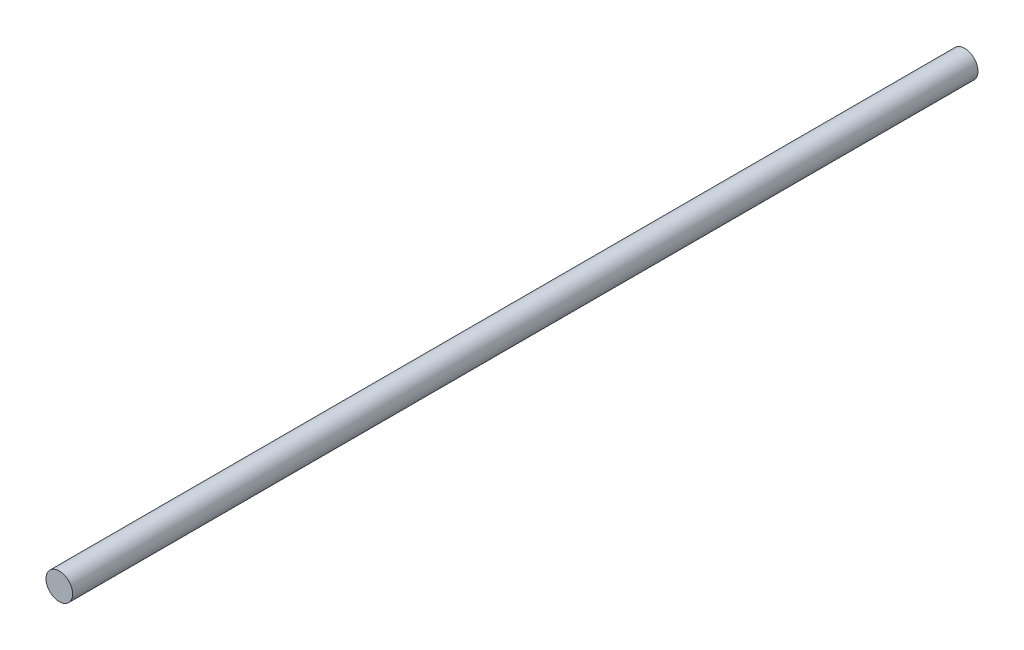
ISO-10303-21;
HEADER;
FILE_DESCRIPTION(('STEP AP214'),'2;1');
FILE_NAME('part.step','',(''),(''),'','','');
FILE_SCHEMA(('AUTOMOTIVE_DESIGN { 1 0 10303 214 1 1 1 1 }'));
ENDSEC;
DATA;
#1=APPLICATION_CONTEXT('core data for automotive mechanical design processes');
#2=APPLICATION_PROTOCOL_DEFINITION('international standard','automotive_design',2000,#1);
#3=PRODUCT_CONTEXT('',#1,'mechanical');
#4=PRODUCT('Part','Part','',(#3));
#5=PRODUCT_RELATED_PRODUCT_CATEGORY('part','',(#4));
#6=PRODUCT_DEFINITION_FORMATION('','',#4);
#7=PRODUCT_DEFINITION_CONTEXT('part definition',#1,'design');
#8=PRODUCT_DEFINITION('design','',#6,#7);
#9=PRODUCT_DEFINITION_SHAPE('','',#8);
#10=(LENGTH_UNIT() NAMED_UNIT(*) SI_UNIT(.MILLI.,.METRE.));
#11=(NAMED_UNIT(*) PLANE_ANGLE_UNIT() SI_UNIT($,.RADIAN.));
#12=(NAMED_UNIT(*) SI_UNIT($,.STERADIAN.) SOLID_ANGLE_UNIT());
#13=UNCERTAINTY_MEASURE_WITH_UNIT(LENGTH_MEASURE(1.E-05),#10,'distance_accuracy_value','');
#14=(GEOMETRIC_REPRESENTATION_CONTEXT(3) GLOBAL_UNCERTAINTY_ASSIGNED_CONTEXT((#13)) GLOBAL_UNIT_ASSIGNED_CONTEXT((#10,
#11,#12)) REPRESENTATION_CONTEXT('',''));
#15=CARTESIAN_POINT('',(0.,0.,0.));
#16=DIRECTION('',(0.,0.,1.));
#17=DIRECTION('',(1.,0.,0.));
#18=AXIS2_PLACEMENT_3D('',#15,#16,#17);
#19=CARTESIAN_POINT('',(0.,0.,170.));
#20=DIRECTION('',(0.,0.,-1.));
#21=DIRECTION('',(-1.,0.,0.));
#22=AXIS2_PLACEMENT_3D('',#19,#20,#21);
#23=CYLINDRICAL_SURFACE('',#22,2.5);
#24=CARTESIAN_POINT('',(0.,0.,170.));
#25=DIRECTION('',(0.,0.,1.));
#26=DIRECTION('',(1.,0.,0.));
#27=AXIS2_PLACEMENT_3D('',#24,#25,#26);
#28=CIRCLE('',#27,2.5);
#29=CARTESIAN_POINT('',(2.5,0.,170.));
#30=VERTEX_POINT('',#29);
#31=EDGE_CURVE('E10',#30,#30,#28,.T.);
#32=ORIENTED_EDGE('',*,*,#31,.F.);
#33=EDGE_LOOP('',(#32));
#34=FACE_BOUND('',#33,.T.);
#35=CARTESIAN_POINT('',(0.,0.,0.));
#36=DIRECTION('',(0.,0.,1.));
#37=DIRECTION('',(1.,0.,0.));
#38=AXIS2_PLACEMENT_3D('',#35,#36,#37);
#39=CIRCLE('',#38,2.5);
#40=CARTESIAN_POINT('',(2.5,0.,0.));
#41=VERTEX_POINT('',#40);
#42=EDGE_CURVE('E46',#41,#41,#39,.T.);
#43=ORIENTED_EDGE('',*,*,#42,.T.);
#44=EDGE_LOOP('',(#43));
#45=FACE_BOUND('',#44,.T.);
#46=ADVANCED_FACE('F43',(#34,#45),#23,.T.);
#47=CARTESIAN_POINT('',(0.,0.,170.));
#48=DIRECTION('',(0.,0.,1.));
#49=DIRECTION('',(1.,0.,0.));
#50=AXIS2_PLACEMENT_3D('',#47,#48,#49);
#51=PLANE('',#50);
#52=ORIENTED_EDGE('',*,*,#31,.T.);
#53=EDGE_LOOP('',(#52));
#54=FACE_BOUND('',#53,.T.);
#55=ADVANCED_FACE('F60',(#54),#51,.T.);
#56=CARTESIAN_POINT('',(0.,0.,0.));
#57=DIRECTION('',(0.,0.,1.));
#58=DIRECTION('',(1.,0.,0.));
#59=AXIS2_PLACEMENT_3D('',#56,#57,#58);
#60=PLANE('',#59);
#61=ORIENTED_EDGE('',*,*,#42,.F.);
#62=EDGE_LOOP('',(#61));
#63=FACE_BOUND('',#62,.T.);
#64=ADVANCED_FACE('F58',(#63),#60,.F.);
#65=CLOSED_SHELL('',(#46,#55,#64));
#66=MANIFOLD_SOLID_BREP('B2',#65);
#67=ADVANCED_BREP_SHAPE_REPRESENTATION('',(#18,#66),#14);
#68=SHAPE_DEFINITION_REPRESENTATION(#9,#67);
ENDSEC;
END-ISO-10303-21;
